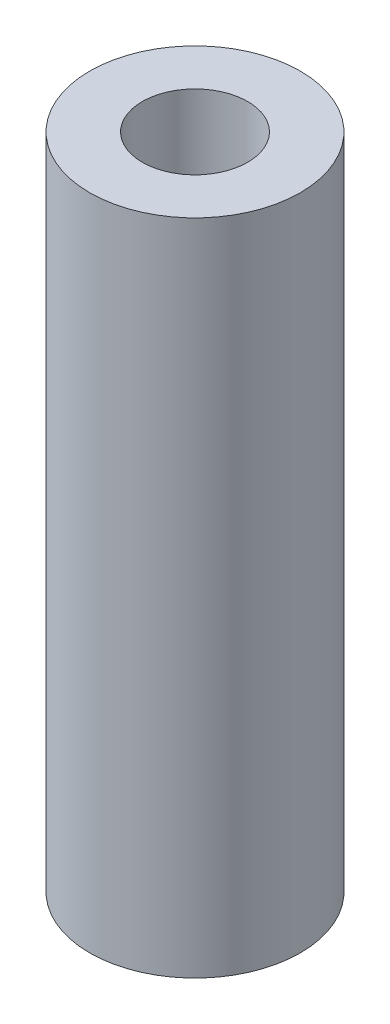
ISO-10303-21;
HEADER;
FILE_DESCRIPTION(('STEP AP214'),'2;1');
FILE_NAME('part.step','',(''),(''),'','','');
FILE_SCHEMA(('AUTOMOTIVE_DESIGN { 1 0 10303 214 1 1 1 1 }'));
ENDSEC;
DATA;
#1=APPLICATION_CONTEXT('core data for automotive mechanical design processes');
#2=APPLICATION_PROTOCOL_DEFINITION('international standard','automotive_design',2000,#1);
#3=PRODUCT_CONTEXT('',#1,'mechanical');
#4=PRODUCT('Part','Part','',(#3));
#5=PRODUCT_RELATED_PRODUCT_CATEGORY('part','',(#4));
#6=PRODUCT_DEFINITION_FORMATION('','',#4);
#7=PRODUCT_DEFINITION_CONTEXT('part definition',#1,'design');
#8=PRODUCT_DEFINITION('design','',#6,#7);
#9=PRODUCT_DEFINITION_SHAPE('','',#8);
#10=(LENGTH_UNIT() NAMED_UNIT(*) SI_UNIT(.MILLI.,.METRE.));
#11=(NAMED_UNIT(*) PLANE_ANGLE_UNIT() SI_UNIT($,.RADIAN.));
#12=(NAMED_UNIT(*) SI_UNIT($,.STERADIAN.) SOLID_ANGLE_UNIT());
#13=UNCERTAINTY_MEASURE_WITH_UNIT(LENGTH_MEASURE(1.E-05),#10,'distance_accuracy_value','');
#14=(GEOMETRIC_REPRESENTATION_CONTEXT(3) GLOBAL_UNCERTAINTY_ASSIGNED_CONTEXT((#13)) GLOBAL_UNIT_ASSIGNED_CONTEXT((#10,
#11,#12)) REPRESENTATION_CONTEXT('',''));
#15=CARTESIAN_POINT('',(0.,0.,0.));
#16=DIRECTION('',(0.,0.,1.));
#17=DIRECTION('',(1.,0.,0.));
#18=AXIS2_PLACEMENT_3D('',#15,#16,#17);
#19=CARTESIAN_POINT('',(0.,25.,0.));
#20=DIRECTION('',(0.,1.,0.));
#21=DIRECTION('',(0.,0.,1.));
#22=AXIS2_PLACEMENT_3D('',#19,#20,#21);
#23=PLANE('',#22);
#24=CARTESIAN_POINT('',(0.,25.,0.));
#25=DIRECTION('',(0.,1.,0.));
#26=DIRECTION('',(0.,0.,1.));
#27=AXIS2_PLACEMENT_3D('',#24,#25,#26);
#28=CIRCLE('',#27,4.);
#29=CARTESIAN_POINT('',(0.,25.,4.));
#30=VERTEX_POINT('',#29);
#31=EDGE_CURVE('E10',#30,#30,#28,.T.);
#32=ORIENTED_EDGE('',*,*,#31,.T.);
#33=EDGE_LOOP('',(#32));
#34=FACE_BOUND('',#33,.T.);
#35=CARTESIAN_POINT('',(0.,25.,0.));
#36=DIRECTION('',(0.,1.,0.));
#37=DIRECTION('',(0.,0.,1.));
#38=AXIS2_PLACEMENT_3D('',#35,#36,#37);
#39=CIRCLE('',#38,2.);
#40=CARTESIAN_POINT('',(0.,25.,2.));
#41=VERTEX_POINT('',#40);
#42=EDGE_CURVE('E41',#41,#41,#39,.T.);
#43=ORIENTED_EDGE('',*,*,#42,.F.);
#44=EDGE_LOOP('',(#43));
#45=FACE_BOUND('',#44,.T.);
#46=ADVANCED_FACE('F30',(#34,#45),#23,.T.);
#47=CARTESIAN_POINT('',(0.,0.,0.));
#48=DIRECTION('',(0.,1.,0.));
#49=DIRECTION('',(0.,0.,1.));
#50=AXIS2_PLACEMENT_3D('',#47,#48,#49);
#51=PLANE('',#50);
#52=CARTESIAN_POINT('',(0.,0.,0.));
#53=DIRECTION('',(0.,1.,0.));
#54=DIRECTION('',(0.,0.,1.));
#55=AXIS2_PLACEMENT_3D('',#52,#53,#54);
#56=CIRCLE('',#55,4.);
#57=CARTESIAN_POINT('',(0.,0.,4.));
#58=VERTEX_POINT('',#57);
#59=EDGE_CURVE('E34',#58,#58,#56,.T.);
#60=ORIENTED_EDGE('',*,*,#59,.F.);
#61=EDGE_LOOP('',(#60));
#62=FACE_BOUND('',#61,.T.);
#63=CARTESIAN_POINT('',(0.,0.,0.));
#64=DIRECTION('',(0.,1.,0.));
#65=DIRECTION('',(0.,0.,1.));
#66=AXIS2_PLACEMENT_3D('',#63,#64,#65);
#67=CIRCLE('',#66,2.);
#68=CARTESIAN_POINT('',(0.,0.,2.));
#69=VERTEX_POINT('',#68);
#70=EDGE_CURVE('E43',#69,#69,#67,.T.);
#71=ORIENTED_EDGE('',*,*,#70,.T.);
#72=EDGE_LOOP('',(#71));
#73=FACE_BOUND('',#72,.T.);
#74=ADVANCED_FACE('F53',(#62,#73),#51,.F.);
#75=CARTESIAN_POINT('',(0.,25.,0.));
#76=DIRECTION('',(0.,-1.,0.));
#77=DIRECTION('',(0.,0.,-1.));
#78=AXIS2_PLACEMENT_3D('',#75,#76,#77);
#79=CYLINDRICAL_SURFACE('',#78,4.);
#80=ORIENTED_EDGE('',*,*,#31,.F.);
#81=EDGE_LOOP('',(#80));
#82=FACE_BOUND('',#81,.T.);
#83=ORIENTED_EDGE('',*,*,#59,.T.);
#84=EDGE_LOOP('',(#83));
#85=FACE_BOUND('',#84,.T.);
#86=ADVANCED_FACE('F32',(#82,#85),#79,.T.);
#87=CARTESIAN_POINT('',(0.,25.,0.));
#88=DIRECTION('',(0.,-1.,0.));
#89=DIRECTION('',(0.,0.,-1.));
#90=AXIS2_PLACEMENT_3D('',#87,#88,#89);
#91=CYLINDRICAL_SURFACE('',#90,2.);
#92=ORIENTED_EDGE('',*,*,#42,.T.);
#93=EDGE_LOOP('',(#92));
#94=FACE_BOUND('',#93,.T.);
#95=ORIENTED_EDGE('',*,*,#70,.F.);
#96=EDGE_LOOP('',(#95));
#97=FACE_BOUND('',#96,.T.);
#98=ADVANCED_FACE('F49',(#94,#97),#91,.F.);
#99=CLOSED_SHELL('',(#46,#74,#86,#98));
#100=MANIFOLD_SOLID_BREP('B2',#99);
#101=ADVANCED_BREP_SHAPE_REPRESENTATION('',(#18,#100),#14);
#102=SHAPE_DEFINITION_REPRESENTATION(#9,#101);
ENDSEC;
END-ISO-10303-21;
